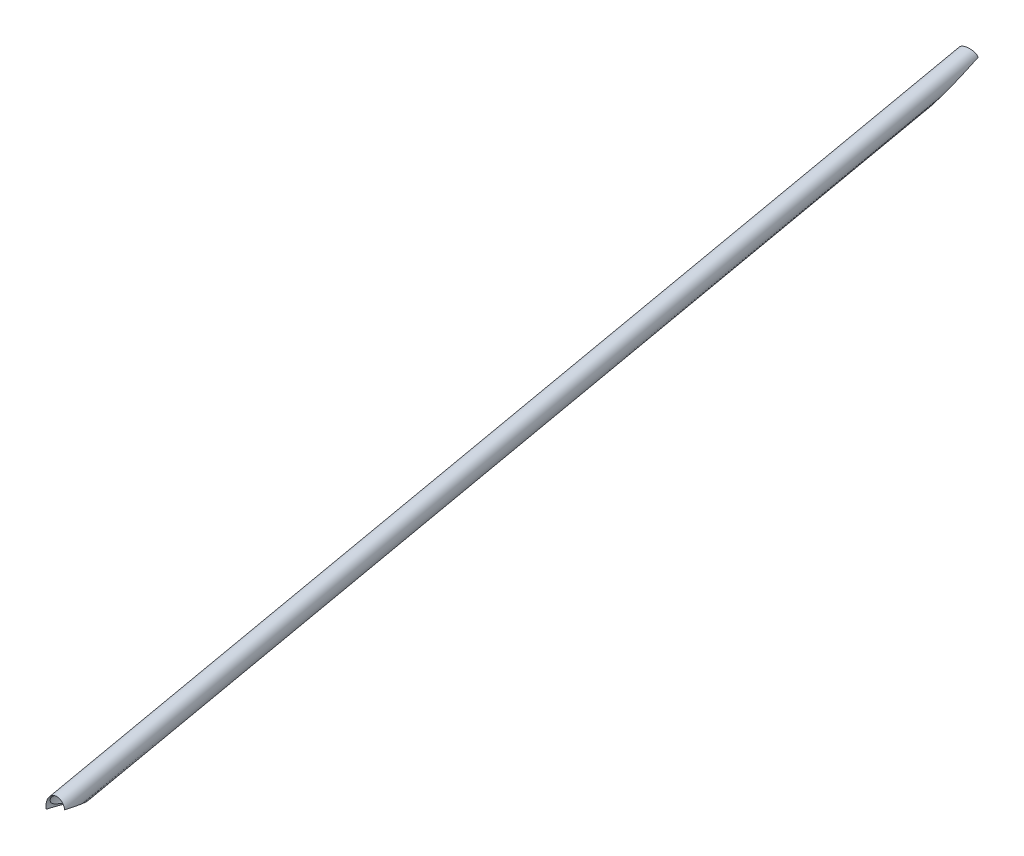
ISO-10303-21;
HEADER;
FILE_DESCRIPTION(('STEP AP214'),'2;1');
FILE_NAME('part.step','',(''),(''),'','','');
FILE_SCHEMA(('AUTOMOTIVE_DESIGN { 1 0 10303 214 1 1 1 1 }'));
ENDSEC;
DATA;
#1=APPLICATION_CONTEXT('core data for automotive mechanical design processes');
#2=APPLICATION_PROTOCOL_DEFINITION('international standard','automotive_design',2000,#1);
#3=PRODUCT_CONTEXT('',#1,'mechanical');
#4=PRODUCT('Part','Part','',(#3));
#5=PRODUCT_RELATED_PRODUCT_CATEGORY('part','',(#4));
#6=PRODUCT_DEFINITION_FORMATION('','',#4);
#7=PRODUCT_DEFINITION_CONTEXT('part definition',#1,'design');
#8=PRODUCT_DEFINITION('design','',#6,#7);
#9=PRODUCT_DEFINITION_SHAPE('','',#8);
#10=(LENGTH_UNIT() NAMED_UNIT(*) SI_UNIT(.MILLI.,.METRE.));
#11=(NAMED_UNIT(*) PLANE_ANGLE_UNIT() SI_UNIT($,.RADIAN.));
#12=(NAMED_UNIT(*) SI_UNIT($,.STERADIAN.) SOLID_ANGLE_UNIT());
#13=UNCERTAINTY_MEASURE_WITH_UNIT(LENGTH_MEASURE(1.E-05),#10,'distance_accuracy_value','');
#14=(GEOMETRIC_REPRESENTATION_CONTEXT(3) GLOBAL_UNCERTAINTY_ASSIGNED_CONTEXT((#13)) GLOBAL_UNIT_ASSIGNED_CONTEXT((#10,
#11,#12)) REPRESENTATION_CONTEXT('',''));
#15=CARTESIAN_POINT('',(0.,0.,0.));
#16=DIRECTION('',(0.,0.,1.));
#17=DIRECTION('',(1.,0.,0.));
#18=AXIS2_PLACEMENT_3D('',#15,#16,#17);
#19=CARTESIAN_POINT('',(-325.,320.,-1580.));
#20=DIRECTION('',(0.0427126536783039,-0.062929792122569,-0.997103540500769));
#21=DIRECTION('',(0.,0.998014330188054,-0.0629872744234135));
#22=AXIS2_PLACEMENT_3D('',#19,#20,#21);
#23=PLANE('',#22);
#24=CARTESIAN_POINT('',(-325.,320.,-1580.));
#25=DIRECTION('',(0.0427126536783039,-0.062929792122569,-0.997103540500769));
#26=DIRECTION('',(-0.611440895819702,0.787641342485715,-0.0759022168747456));
#27=AXIS2_PLACEMENT_3D('',#24,#25,#26);
#28=ELLIPSE('',#27,11.2549576190536,11.);
#29=CARTESIAN_POINT('',(-315.659557692795,325.814860529695,-1579.96687694731));
#30=VERTEX_POINT('',#29);
#31=CARTESIAN_POINT('',(-314.891903689022,324.374891386604,-1579.84311297152));
#32=VERTEX_POINT('',#31);
#33=EDGE_CURVE('E116',#30,#32,#28,.T.);
#34=ORIENTED_EDGE('',*,*,#33,.T.);
#35=CARTESIAN_POINT('',(-325.,320.,-1580.));
#36=DIRECTION('',(0.0427126536783039,-0.062929792122569,-0.997103540500769));
#37=DIRECTION('',(0.489400664257567,-0.868759037548238,0.07579396085779));
#38=AXIS2_PLACEMENT_3D('',#35,#36,#37);
#39=ELLIPSE('',#38,12.7182524712078,11.);
#40=EDGE_CURVE('E121',#32,#30,#39,.F.);
#41=ORIENTED_EDGE('',*,*,#40,.T.);
#42=EDGE_LOOP('',(#34,#41));
#43=FACE_BOUND('',#42,.T.);
#44=ADVANCED_FACE('F41',(#43),#23,.T.);
#45=CARTESIAN_POINT('',(-225.,200.,-450.));
#46=DIRECTION('',(-0.0876619818920292,0.105194378270435,-0.99058039537993));
#47=DIRECTION('',(0.,0.994408591727349,0.105600912395825));
#48=AXIS2_PLACEMENT_3D('',#45,#46,#47);
#49=CYLINDRICAL_SURFACE('',#48,9.79999999999998);
#50=CARTESIAN_POINT('',(-324.508739489875,329.155691586778,-1573.4138672941));
#51=CARTESIAN_POINT('',(-324.268462217856,329.155384934462,-1573.41099257477));
#52=CARTESIAN_POINT('',(-324.028163922259,329.146052864396,-1573.4060575788));
#53=CARTESIAN_POINT('',(-323.549018961354,329.109410245513,-1573.3908155344));
#54=CARTESIAN_POINT('',(-323.310173035085,329.082091209352,-1573.38050595041));
#55=CARTESIAN_POINT('',(-322.835036875438,329.009654067817,-1573.3529590625));
#56=CARTESIAN_POINT('',(-322.598753444107,328.964496821543,-1573.33570652266));
#57=CARTESIAN_POINT('',(-322.130980790888,328.856901620574,-1573.29246922714));
#58=CARTESIAN_POINT('',(-321.899491009931,328.794465693382,-1573.2664854959));
#59=CARTESIAN_POINT('',(-321.44174229571,328.652740938666,-1573.20354928381));
#60=CARTESIAN_POINT('',(-321.215521202537,328.573357048359,-1573.16653444433));
#61=CARTESIAN_POINT('',(-320.771641627187,328.399248591146,-1573.07934124367));
#62=CARTESIAN_POINT('',(-320.553983323649,328.304523704401,-1573.02916260803));
#63=CARTESIAN_POINT('',(-320.129734859475,328.101819282316,-1572.91356185013));
#64=CARTESIAN_POINT('',(-319.923121105446,327.993869767537,-1572.84817396092));
#65=CARTESIAN_POINT('',(-319.522427569048,327.767020417816,-1572.70025295484));
#66=CARTESIAN_POINT('',(-319.328345709577,327.648122405502,-1572.61772268885));
#67=CARTESIAN_POINT('',(-318.972576930882,327.414338245769,-1572.4433427167));
#68=CARTESIAN_POINT('',(-318.809575585291,327.300187997735,-1572.35318194191));
#69=CARTESIAN_POINT('',(-318.495933350835,327.067788895399,-1572.15788781455));
#70=CARTESIAN_POINT('',(-318.345292655277,326.949539977039,-1572.05275422789));
#71=CARTESIAN_POINT('',(-318.056679613174,326.711262587282,-1571.828119347));
#72=CARTESIAN_POINT('',(-317.918708068977,326.591234003735,-1571.70861714389));
#73=CARTESIAN_POINT('',(-317.655181467535,326.351395739851,-1571.45645322827));
#74=CARTESIAN_POINT('',(-317.529628427703,326.231586098175,-1571.3237893846));
#75=CARTESIAN_POINT('',(-317.243890205332,325.947695339248,-1570.99323696469));
#76=CARTESIAN_POINT('',(-317.089108112663,325.784426307156,-1570.78997641171));
#77=CARTESIAN_POINT('',(-316.799242184499,325.463814239222,-1570.36556608364));
#78=CARTESIAN_POINT('',(-316.66416897332,325.306474433248,-1570.14440675913));
#79=CARTESIAN_POINT('',(-316.4100643807,324.998108519678,-1569.68737158513));
#80=CARTESIAN_POINT('',(-316.29110076506,324.847110820651,-1569.45143932354));
#81=CARTESIAN_POINT('',(-316.122982836111,324.625929440791,-1569.08966179315));
#82=CARTESIAN_POINT('',(-316.068668611629,324.553093652753,-1568.9677659141));
#83=CARTESIAN_POINT('',(-315.96314215767,324.409120794857,-1568.72164743045));
#84=CARTESIAN_POINT('',(-315.911929916655,324.337983718683,-1568.5974248345));
#85=CARTESIAN_POINT('',(-315.778899234167,324.150192584166,-1568.26297596945));
#86=CARTESIAN_POINT('',(-315.699583276547,324.035001080538,-1568.05093195501));
#87=CARTESIAN_POINT('',(-315.547525233777,323.808788671949,-1567.62229190242));
#88=CARTESIAN_POINT('',(-315.474784220197,323.697768448531,-1567.40569512933));
#89=CARTESIAN_POINT('',(-315.334842245937,323.479434879813,-1566.96871709641));
#90=CARTESIAN_POINT('',(-315.267644486624,323.372123697073,-1566.74833373727));
#91=CARTESIAN_POINT('',(-315.138015471025,323.16086581113,-1566.30456582026));
#92=CARTESIAN_POINT('',(-315.075584547522,323.056919343115,-1566.08118105414));
#93=CARTESIAN_POINT('',(-314.89411189487,322.749053807716,-1565.40626682987));
#94=CARTESIAN_POINT('',(-314.781219078692,322.549628628731,-1564.95103119567));
#95=CARTESIAN_POINT('',(-314.5678216649,322.1601954055,-1564.03393158466));
#96=CARTESIAN_POINT('',(-314.467313458796,321.970184627883,-1563.57206958256));
#97=CARTESIAN_POINT('',(-314.275401430575,321.596332224166,-1562.64065031704));
#98=CARTESIAN_POINT('',(-314.184056063738,321.412534626059,-1562.1710634653));
#99=CARTESIAN_POINT('',(-314.009277908373,321.05069315521,-1561.2282011042));
#100=CARTESIAN_POINT('',(-313.925845594235,320.872649627849,-1560.75492537554));
#101=CARTESIAN_POINT('',(-313.765712062502,320.521350684482,-1559.80633404262));
#102=CARTESIAN_POINT('',(-313.689000580378,320.348088253861,-1559.33102275444));
#103=CARTESIAN_POINT('',(-313.541232239728,320.005090206029,-1558.37824818393));
#104=CARTESIAN_POINT('',(-313.470175500241,319.835354663121,-1557.90078485653));
#105=CARTESIAN_POINT('',(-313.334054021778,319.501116690112,-1556.95119260565));
#106=CARTESIAN_POINT('',(-313.268916660941,319.336574018119,-1556.47908820582));
#107=CARTESIAN_POINT('',(-313.1430222647,319.009586204916,-1555.53356903269));
#108=CARTESIAN_POINT('',(-313.082265270288,318.847141083345,-1555.06015424717));
#109=CARTESIAN_POINT('',(-312.906029471048,318.36220055103,-1553.63830717083));
#110=CARTESIAN_POINT('',(-312.796590132545,318.042110541322,-1552.68830241029));
#111=CARTESIAN_POINT('',(-312.592097944712,317.405213502389,-1550.78493171594));
#112=CARTESIAN_POINT('',(-312.497055041223,317.088408882377,-1549.83156391986));
#113=CARTESIAN_POINT('',(-312.320806828936,316.456225520595,-1547.92310192935));
#114=CARTESIAN_POINT('',(-312.239601215361,316.140846747568,-1546.9680077734));
#115=CARTESIAN_POINT('',(-312.091499447856,315.51180422466,-1545.06267745196));
#116=CARTESIAN_POINT('',(-312.024518560362,315.198141823646,-1544.1124474315));
#117=CARTESIAN_POINT('',(-311.90482053405,314.569233317766,-1542.21159173712));
#118=CARTESIAN_POINT('',(-311.852103620119,314.25398718801,-1541.26096605719));
#119=CARTESIAN_POINT('',(-311.76209485636,313.620797672135,-1539.36036212128));
#120=CARTESIAN_POINT('',(-311.724795879752,313.3028556017,-1538.41038376927));
#121=CARTESIAN_POINT('',(-311.667404886,312.66284594251,-1536.51132323718));
#122=CARTESIAN_POINT('',(-311.647312276486,312.340778496168,-1535.56224102738));
#123=CARTESIAN_POINT('',(-311.627043388048,311.691191666295,-1533.6661841849));
#124=CARTESIAN_POINT('',(-311.626857766649,311.36367491234,-1532.71920877216));
#125=CARTESIAN_POINT('',(-311.644659130688,310.866730987072,-1531.30069083397));
#126=CARTESIAN_POINT('',(-311.653610947495,310.700093687073,-1530.82805179804));
#127=CARTESIAN_POINT('',(-311.67830307188,310.364653069603,-1529.88371814603));
#128=CARTESIAN_POINT('',(-311.694043328969,310.195849768252,-1529.41202352295));
#129=CARTESIAN_POINT('',(-311.733383794846,309.854472053615,-1528.46638763432));
#130=CARTESIAN_POINT('',(-311.757041048534,309.681879020815,-1527.99245541475));
#131=CARTESIAN_POINT('',(-311.813436730258,309.333690201409,-1527.04624033991));
#132=CARTESIAN_POINT('',(-311.846174934786,309.158094488808,-1526.57395744433));
#133=CARTESIAN_POINT('',(-311.922369881243,308.803520222796,-1525.63213223618));
#134=CARTESIAN_POINT('',(-311.96581429053,308.624545778909,-1525.16258740221));
#135=CARTESIAN_POINT('',(-312.065786203341,308.262272073939,-1524.22661188544));
#136=CARTESIAN_POINT('',(-312.122312195228,308.078973314746,-1523.76018084922));
#137=CARTESIAN_POINT('',(-312.252437834875,307.705247882916,-1522.82741352473));
#138=CARTESIAN_POINT('',(-312.326189900717,307.514771118661,-1522.36111765442));
#139=CARTESIAN_POINT('',(-312.453720291011,307.223463723417,-1521.66635861196));
#140=CARTESIAN_POINT('',(-312.499120904391,307.125291629591,-1521.4352413765));
#141=CARTESIAN_POINT('',(-312.596617841785,306.926875325517,-1520.97533693104));
#142=CARTESIAN_POINT('',(-312.648713343141,306.826631371123,-1520.74654943849));
#143=CARTESIAN_POINT('',(-312.76060529518,306.624388734751,-1520.29355533346));
#144=CARTESIAN_POINT('',(-312.820347897791,306.522406277369,-1520.06932831505));
#145=CARTESIAN_POINT('',(-312.949679329555,306.315611434241,-1519.62506889827));
#146=CARTESIAN_POINT('',(-313.019265980909,306.210799678559,-1519.40503558431));
#147=CARTESIAN_POINT('',(-313.170706257539,305.998196185259,-1518.97187028511));
#148=CARTESIAN_POINT('',(-313.252508806963,305.890418311339,-1518.75871385765));
#149=CARTESIAN_POINT('',(-313.432518335168,305.670871044554,-1518.34168832311));
#150=CARTESIAN_POINT('',(-313.530702499793,305.559107370463,-1518.13780679486));
#151=CARTESIAN_POINT('',(-313.69607856018,305.386890506061,-1517.84180906562));
#152=CARTESIAN_POINT('',(-313.754816099455,305.328189059809,-1517.74396970626));
#153=CARTESIAN_POINT('',(-313.879523084356,305.209433030582,-1517.55362961636));
#154=CARTESIAN_POINT('',(-313.945499455091,305.149377196317,-1517.4611341295));
#155=CARTESIAN_POINT('',(-314.08543017257,305.028619363818,-1517.28455157514));
#156=CARTESIAN_POINT('',(-314.159303502986,304.967928783378,-1517.20039350135));
#157=CARTESIAN_POINT('',(-314.317044664936,304.845799750756,-1517.04280801468));
#158=CARTESIAN_POINT('',(-314.40089083017,304.784363171073,-1516.9693580842));
#159=CARTESIAN_POINT('',(-314.563698890422,304.67282163741,-1516.84972524615));
#160=CARTESIAN_POINT('',(-314.640756831397,304.622696062413,-1516.80101240086));
#161=CARTESIAN_POINT('',(-314.802722896911,304.523563000484,-1516.71708832579));
#162=CARTESIAN_POINT('',(-314.887629307008,304.47455527227,-1516.68187415594));
#163=CARTESIAN_POINT('',(-315.065077427135,304.378811345447,-1516.62809566722));
#164=CARTESIAN_POINT('',(-315.157685839986,304.332102131473,-1516.60969798977));
#165=CARTESIAN_POINT('',(-315.346905626979,304.243477520672,-1516.59232483161));
#166=CARTESIAN_POINT('',(-315.443514327192,304.201558989869,-1516.59333657961));
#167=CARTESIAN_POINT('',(-315.626560441187,304.128121957754,-1516.61301863811));
#168=CARTESIAN_POINT('',(-315.712965781718,304.095968728491,-1516.6297638109));
#169=CARTESIAN_POINT('',(-315.884005177224,304.036806489417,-1516.67621740403));
#170=CARTESIAN_POINT('',(-315.968637778797,304.009801564044,-1516.70593605598));
#171=CARTESIAN_POINT('',(-316.185368256323,303.945736211366,-1516.79713665646));
#172=CARTESIAN_POINT('',(-316.315065373529,303.912534111049,-1516.86694681826));
#173=CARTESIAN_POINT('',(-316.565282102444,303.856270163453,-1517.02471591539));
#174=CARTESIAN_POINT('',(-316.685770827721,303.833241301817,-1517.11273254849));
#175=CARTESIAN_POINT('',(-316.917723217268,303.795072222553,-1517.30042125114));
#176=CARTESIAN_POINT('',(-317.029217594546,303.779904108381,-1517.40005054516));
#177=CARTESIAN_POINT('',(-317.244987731152,303.755535614636,-1517.60760216894));
#178=CARTESIAN_POINT('',(-317.349255600484,303.746341668818,-1517.71553329982));
#179=CARTESIAN_POINT('',(-317.551874137249,303.732627771104,-1517.93753319046));
#180=CARTESIAN_POINT('',(-317.650209289523,303.728119613312,-1518.05161668097));
#181=CARTESIAN_POINT('',(-317.841584475889,303.722887546103,-1518.28408468139));
#182=CARTESIAN_POINT('',(-317.934627216381,303.722161684993,-1518.40246694133));
#183=CARTESIAN_POINT('',(-318.194269654661,303.724476652333,-1518.7456012645));
#184=CARTESIAN_POINT('',(-318.355446235069,303.73128599644,-1518.974424597));
#185=CARTESIAN_POINT('',(-318.666218808637,303.752555367771,-1519.43952090882));
#186=CARTESIAN_POINT('',(-318.815807028671,303.76702048018,-1519.67579874143));
#187=CARTESIAN_POINT('',(-319.106045303391,303.801844104615,-1520.15400240679));
#188=CARTESIAN_POINT('',(-319.246676019106,303.822214873582,-1520.3959390141));
#189=CARTESIAN_POINT('',(-319.520399720282,303.867620066768,-1520.88361558397));
#190=CARTESIAN_POINT('',(-319.653491812882,303.892655041906,-1521.12935599266));
#191=CARTESIAN_POINT('',(-319.914008631707,303.946669865335,-1521.6249144722));
#192=CARTESIAN_POINT('',(-320.041402779519,303.975668236639,-1521.87474652978));
#193=CARTESIAN_POINT('',(-320.290796946808,304.036892386498,-1522.37670443827));
#194=CARTESIAN_POINT('',(-320.412796663534,304.069118345865,-1522.62883041697));
#195=CARTESIAN_POINT('',(-320.651961099819,304.136278985237,-1523.13455168497));
#196=CARTESIAN_POINT('',(-320.769132519923,304.171209703405,-1523.38814434));
#197=CARTESIAN_POINT('',(-320.999396948486,304.243462461804,-1523.89682278359));
#198=CARTESIAN_POINT('',(-321.112490054811,304.280784444596,-1524.15190853615));
#199=CARTESIAN_POINT('',(-321.443986861764,304.395077203072,-1524.91353899504));
#200=CARTESIAN_POINT('',(-321.657156774873,304.475110559271,-1525.42190595589));
#201=CARTESIAN_POINT('',(-322.072151540842,304.641805445488,-1526.44219036377));
#202=CARTESIAN_POINT('',(-322.273975306176,304.728467609004,-1526.95410814589));
#203=CARTESIAN_POINT('',(-322.668206131507,304.907378807367,-1527.98076784604));
#204=CARTESIAN_POINT('',(-322.86061018138,304.999629607294,-1528.49551060912));
#205=CARTESIAN_POINT('',(-323.237339140959,305.188930854004,-1529.52706811478));
#206=CARTESIAN_POINT('',(-323.421663882965,305.285981400324,-1530.04388290013));
#207=CARTESIAN_POINT('',(-323.783607451138,305.484492488036,-1531.08001890965));
#208=CARTESIAN_POINT('',(-323.961214415395,305.585960206506,-1531.59934289388));
#209=CARTESIAN_POINT('',(-324.310232431688,305.792743132048,-1532.63930345545));
#210=CARTESIAN_POINT('',(-324.481643437547,305.898058367785,-1533.15994004254));
#211=CARTESIAN_POINT('',(-324.987568058076,306.219253005989,-1534.72322712489));
#212=CARTESIAN_POINT('',(-325.313845348294,306.440421467298,-1535.76746317491));
#213=CARTESIAN_POINT('',(-325.947865629235,306.894832452987,-1537.85647235823));
#214=CARTESIAN_POINT('',(-326.255644923264,307.128049538093,-1538.90124009161));
#215=CARTESIAN_POINT('',(-326.856271078424,307.606358981848,-1540.99239596754));
#216=CARTESIAN_POINT('',(-327.14911723304,307.851451901299,-1542.03878418433));
#217=CARTESIAN_POINT('',(-327.721824607873,308.353376478358,-1544.1312790954));
#218=CARTESIAN_POINT('',(-328.001696693615,308.610197942102,-1545.17738526814));
#219=CARTESIAN_POINT('',(-328.550494495169,309.136605022868,-1547.26922475248));
#220=CARTESIAN_POINT('',(-328.819420532671,309.406190264276,-1548.31495807414));
#221=CARTESIAN_POINT('',(-329.322811839342,309.933701426403,-1550.3058613186));
#222=CARTESIAN_POINT('',(-329.558126977379,310.190309488514,-1551.25116564137));
#223=CARTESIAN_POINT('',(-330.022128191402,310.717850221648,-1553.13962404692));
#224=CARTESIAN_POINT('',(-330.250813043114,310.988785512419,-1554.08277770331));
#225=CARTESIAN_POINT('',(-330.589511235814,311.408772143102,-1555.4942753125));
#226=CARTESIAN_POINT('',(-330.701666302686,311.55100072447,-1555.96413857069));
#227=CARTESIAN_POINT('',(-330.924662391806,311.840737058636,-1556.90254492151));
#228=CARTESIAN_POINT('',(-331.03550343047,311.988244745389,-1557.37108803058));
#229=CARTESIAN_POINT('',(-331.255956817724,312.289431616732,-1558.30640007514));
#230=CARTESIAN_POINT('',(-331.365569348727,312.443109869141,-1558.77316926704));
#231=CARTESIAN_POINT('',(-331.583655205451,312.757872615585,-1559.70446403109));
#232=CARTESIAN_POINT('',(-331.692128560616,312.918956917623,-1560.16898966106));
#233=CARTESIAN_POINT('',(-331.915359987302,313.261494219682,-1561.12680398728));
#234=CARTESIAN_POINT('',(-332.030039668569,313.443586645677,-1561.61988365235));
#235=CARTESIAN_POINT('',(-332.258056688282,313.820811810879,-1562.60145086819));
#236=CARTESIAN_POINT('',(-332.371393832088,314.015946414342,-1563.08993775103));
#237=CARTESIAN_POINT('',(-332.596451098388,314.423186931333,-1564.06068841944));
#238=CARTESIAN_POINT('',(-332.708170017679,314.635304777198,-1564.5429475482));
#239=CARTESIAN_POINT('',(-332.873730499241,314.970211484922,-1565.25891785446));
#240=CARTESIAN_POINT('',(-332.928575842523,315.084623592522,-1565.49631579399));
#241=CARTESIAN_POINT('',(-333.037366086136,315.319952523769,-1565.96806627113));
#242=CARTESIAN_POINT('',(-333.091311040889,315.440868952401,-1566.2024189926));
#243=CARTESIAN_POINT('',(-333.211163889499,315.721071352655,-1566.72480953111));
#244=CARTESIAN_POINT('',(-333.276734982408,315.882456855734,-1567.01180774677));
#245=CARTESIAN_POINT('',(-333.404992926487,316.219412918592,-1567.57798278386));
#246=CARTESIAN_POINT('',(-333.467680524206,316.394979773943,-1567.85716162235));
#247=CARTESIAN_POINT('',(-333.588506472434,316.762946933065,-1568.40465494302));
#248=CARTESIAN_POINT('',(-333.646651895587,316.955320036507,-1568.67298598874));
#249=CARTESIAN_POINT('',(-333.756010489853,317.3602352138,-1569.19549570415));
#250=CARTESIAN_POINT('',(-333.807227194151,317.572766913331,-1569.44968154773));
#251=CARTESIAN_POINT('',(-333.884171721041,317.948487037498,-1569.860165679));
#252=CARTESIAN_POINT('',(-333.912792244731,318.105477000578,-1570.02159048381));
#253=CARTESIAN_POINT('',(-333.963566132739,318.430465239119,-1570.33400142513));
#254=CARTESIAN_POINT('',(-333.985721887595,318.598459417242,-1570.48499140442));
#255=CARTESIAN_POINT('',(-334.021744053221,318.945227537559,-1570.77459253945));
#256=CARTESIAN_POINT('',(-334.035623803679,319.123983618237,-1570.91322330791));
#257=CARTESIAN_POINT('',(-334.053192462749,319.491813481666,-1571.17681854285));
#258=CARTESIAN_POINT('',(-334.056881825603,319.680886804138,-1571.30178361825));
#259=CARTESIAN_POINT('',(-334.052138912278,320.06947338724,-1571.5379549131));
#260=CARTESIAN_POINT('',(-334.043605977199,320.269060151263,-1571.64903859142));
#261=CARTESIAN_POINT('',(-334.012556302572,320.67498964346,-1571.85587306078));
#262=CARTESIAN_POINT('',(-333.990039085936,320.8813326019,-1571.95162332855));
#263=CARTESIAN_POINT('',(-333.929771519599,321.298346719427,-1572.12835752254));
#264=CARTESIAN_POINT('',(-333.892003657665,321.509022589124,-1572.20932431723));
#265=CARTESIAN_POINT('',(-333.800542974006,321.931721617294,-1572.35753194896));
#266=CARTESIAN_POINT('',(-333.74685012761,322.143744777855,-1572.42477276475));
#267=CARTESIAN_POINT('',(-333.629276710887,322.546235967368,-1572.54127194721));
#268=CARTESIAN_POINT('',(-333.566869450526,322.736818858066,-1572.59163705024));
#269=CARTESIAN_POINT('',(-333.429003410921,323.115281399367,-1572.68381146962));
#270=CARTESIAN_POINT('',(-333.35354583552,323.30316129758,-1572.72562157437));
#271=CARTESIAN_POINT('',(-333.18986649637,323.674786210649,-1572.80201996259));
#272=CARTESIAN_POINT('',(-333.101643749711,323.858530905837,-1572.83660768945));
#273=CARTESIAN_POINT('',(-332.912858310884,324.220634016993,-1572.89980083997));
#274=CARTESIAN_POINT('',(-332.812294533623,324.398991957606,-1572.92840573699));
#275=CARTESIAN_POINT('',(-332.584485163934,324.773662296555,-1572.98439417987));
#276=CARTESIAN_POINT('',(-332.455474312445,324.969011760708,-1573.01105164639));
#277=CARTESIAN_POINT('',(-332.182935394757,325.349946625541,-1573.05945640332));
#278=CARTESIAN_POINT('',(-332.039406348059,325.535531365462,-1573.08120336176));
#279=CARTESIAN_POINT('',(-331.738707348242,325.895803179059,-1573.12095429782));
#280=CARTESIAN_POINT('',(-331.581533908916,326.070487447899,-1573.13895731481));
#281=CARTESIAN_POINT('',(-331.254538351328,326.407879510486,-1573.17214559107));
#282=CARTESIAN_POINT('',(-331.084715477769,326.570586587919,-1573.18733068187));
#283=CARTESIAN_POINT('',(-330.714428940016,326.900003881781,-1573.21713535041));
#284=CARTESIAN_POINT('',(-330.51263739317,327.065246004316,-1573.23151641065));
#285=CARTESIAN_POINT('',(-330.096169130773,327.37879344857,-1573.25841957194));
#286=CARTESIAN_POINT('',(-329.881491393652,327.527097424782,-1573.27094152535));
#287=CARTESIAN_POINT('',(-329.440544873409,327.805904136236,-1573.29458670889));
#288=CARTESIAN_POINT('',(-329.214266520493,327.936391838235,-1573.30570875719));
#289=CARTESIAN_POINT('',(-328.751819196653,328.178557889196,-1573.32675507398));
#290=CARTESIAN_POINT('',(-328.515650563179,328.290236879249,-1573.33667938329));
#291=CARTESIAN_POINT('',(-328.026822330638,328.497513746336,-1573.35563354995));
#292=CARTESIAN_POINT('',(-327.773875088411,328.592437793563,-1573.3646216579));
#293=CARTESIAN_POINT('',(-327.260853516326,328.760711910301,-1573.38103455383));
#294=CARTESIAN_POINT('',(-327.000779225195,328.834062097008,-1573.38845935031));
#295=CARTESIAN_POINT('',(-326.475934647514,328.958505124931,-1573.40119395844));
#296=CARTESIAN_POINT('',(-326.211176208482,329.009647542611,-1573.40650847877));
#297=CARTESIAN_POINT('',(-325.678372617681,329.089494506777,-1573.41422914122));
#298=CARTESIAN_POINT('',(-325.41032958797,329.11821283688,-1573.41663707046));
#299=CARTESIAN_POINT('',(-325.036290306998,329.142441945273,-1573.4171773283));
#300=CARTESIAN_POINT('',(-324.930848284082,329.147526857415,-1573.41701903822));
#301=CARTESIAN_POINT('',(-324.719852026231,329.154219109096,-1573.4159954947));
#302=CARTESIAN_POINT('',(-324.614297786838,329.155826304872,-1573.41513021204));
#303=CARTESIAN_POINT('',(-324.508739489875,329.155691586778,-1573.4138672941));
#304=B_SPLINE_CURVE_WITH_KNOTS('',3,(#50,#51,#52,#53,#54,#55,#56,#57,#58,#59,#60,#61,#62,#63,
#64,#65,#66,#67,#68,#69,#70,#71,#72,#73,#74,#75,#76,#77,#78,#79,#80,#81,#82,#83,#84,#85,#86,#87,
#88,#89,#90,#91,#92,#93,#94,#95,#96,#97,#98,#99,#100,#101,#102,#103,#104,#105,#106,#107,#108,
#109,#110,#111,#112,#113,#114,#115,#116,#117,#118,#119,#120,#121,#122,#123,#124,#125,#126,#127,
#128,#129,#130,#131,#132,#133,#134,#135,#136,#137,#138,#139,#140,#141,#142,#143,#144,#145,#146,
#147,#148,#149,#150,#151,#152,#153,#154,#155,#156,#157,#158,#159,#160,#161,#162,#163,#164,#165,
#166,#167,#168,#169,#170,#171,#172,#173,#174,#175,#176,#177,#178,#179,#180,#181,#182,#183,#184,
#185,#186,#187,#188,#189,#190,#191,#192,#193,#194,#195,#196,#197,#198,#199,#200,#201,#202,#203,
#204,#205,#206,#207,#208,#209,#210,#211,#212,#213,#214,#215,#216,#217,#218,#219,#220,#221,#222,
#223,#224,#225,#226,#227,#228,#229,#230,#231,#232,#233,#234,#235,#236,#237,#238,#239,#240,#241,
#242,#243,#244,#245,#246,#247,#248,#249,#250,#251,#252,#253,#254,#255,#256,#257,#258,#259,#260,
#261,#262,#263,#264,#265,#266,#267,#268,#269,#270,#271,#272,#273,#274,#275,#276,#277,#278,#279,
#280,#281,#282,#283,#284,#285,#286,#287,#288,#289,#290,#291,#292,#293,#294,#295,#296,#297,#298,
#299,#300,#301,#302,#303),.UNSPECIFIED.,.T.,.F.,(4,2,2,2,2,2,2,2,2,2,2,2,2,2,2,2,2,2,2,2,2,2,2,
2,2,2,2,2,2,2,2,2,2,2,2,2,2,2,2,2,2,2,2,2,2,2,2,2,2,2,2,2,2,2,2,2,2,2,2,2,2,2,2,2,2,2,2,2,2,2,2,
2,2,2,2,2,2,2,2,2,2,2,2,2,2,2,2,2,2,2,2,2,2,2,2,2,2,2,2,2,2,2,2,2,2,2,2,2,2,2,2,2,2,2,2,2,2,2,2,
2,2,2,2,2,2,2,4),(0.,0.720799098111247,1.44193855704914,2.16466922089066,2.88731511451336,
3.61412620543011,4.34095245125645,5.06615831884392,5.79124367679238,6.44575503682462,
7.10027663079302,7.75483964760211,8.40950882544345,9.31755356214505,10.2260859972985,
11.138328776811,11.5943789870863,12.0504275011268,12.8122618298481,13.5742200977074,
14.3366153785937,15.0990638352489,16.6276177515494,18.1557252363007,19.693032584593,
21.230432036851,22.7654409719947,24.3004822123385,25.8129999752639,27.3255318903921,
30.350692689847,33.377933995387,36.4051086148223,39.4137111850813,42.4223611862941,
45.4296189110935,48.4367730996686,51.4425160057374,52.9461777766895,54.4498283644198,
55.964555341448,57.4792450401574,58.9921980340451,60.5049762865401,62.0316838750842,
62.7971263183791,63.5624747950396,64.3227033519033,65.0827639854926,65.8397313753257,
66.5956532280853,66.9804033103963,67.3655247314467,67.7470179207558,68.1276969436699,
68.4388616219228,68.7499584884003,69.0641057347824,69.3780462810651,69.6579721623582,
69.9381192086672,70.3884643006441,70.8402590591093,71.2904392968674,71.7411035468996,
72.1928993899029,72.6444620800249,73.4836766459796,74.3234493435841,75.1649775865233,
76.006605290921,76.8523101755427,77.6980624637438,78.542598542283,79.3871143416808,
81.0579730103192,82.7289915583443,84.4005406503425,86.0721244216756,87.7465337311574,
89.4209555170783,92.7691273410848,96.1104978561965,99.4520263119184,102.79070378723,
106.129283072284,109.151332138024,112.173935712253,113.684610887391,115.19526716965,
116.705696091429,118.216085878079,119.829921376166,121.443988052083,123.059198885463,
123.866649306209,124.674050744802,125.680908877665,126.687504846098,127.692500830691,
128.696982386688,129.377438029421,130.057641734043,130.736746066663,131.415820127386,
132.100519083611,132.785241400229,133.470752225783,134.156264113297,134.775951636486,
135.395582026256,136.015260152529,136.634992803482,137.341113647794,138.047282212482,
138.753631740664,139.460023478812,140.242764873188,141.025568402629,141.809028427013,
142.59246174194,143.402464622997,144.212463103717,145.020643935305,145.828327603154,
146.144975031069,146.461635548353),.UNSPECIFIED.);
#305=CARTESIAN_POINT('',(-324.508739489875,329.155691586778,-1573.4138672941));
#306=VERTEX_POINT('',#305);
#307=EDGE_CURVE('E109',#306,#306,#304,.T.);
#308=ORIENTED_EDGE('',*,*,#307,.T.);
#309=EDGE_LOOP('',(#308));
#310=FACE_BOUND('',#309,.T.);
#311=CARTESIAN_POINT('',(-225.452585120845,210.288306343942,-454.079322924064));
#312=CARTESIAN_POINT('',(-225.725490799836,210.287253688898,-454.069421938344));
#313=CARTESIAN_POINT('',(-225.99840840061,210.274807656964,-454.060095957921));
#314=CARTESIAN_POINT('',(-226.542361369307,210.227094706696,-454.041879019836));
#315=CARTESIAN_POINT('',(-226.81339585642,210.191817751833,-454.032988255347));
#316=CARTESIAN_POINT('',(-227.352003262097,210.098515411787,-454.015133533551));
#317=CARTESIAN_POINT('',(-227.619569477782,210.040451276019,-454.006169477169));
#318=CARTESIAN_POINT('',(-228.148825654578,209.901923949884,-453.987866174324));
#319=CARTESIAN_POINT('',(-228.410515636783,209.821460839938,-453.978526929207));
#320=CARTESIAN_POINT('',(-228.926013084578,209.638712094157,-453.959325027898));
#321=CARTESIAN_POINT('',(-229.179823970791,209.536436084334,-453.949462604022));
#322=CARTESIAN_POINT('',(-229.677860112655,209.310758687423,-453.929211262946));
#323=CARTESIAN_POINT('',(-229.92208509908,209.18735670752,-453.918822330978));
#324=CARTESIAN_POINT('',(-230.399078140652,208.920396086984,-453.897673749304));
#325=CARTESIAN_POINT('',(-230.631851903038,208.776847627579,-453.886914288908));
#326=CARTESIAN_POINT('',(-231.084440257298,208.470610733691,-453.865321063755));
#327=CARTESIAN_POINT('',(-231.304254967317,208.307922473745,-453.854487299677));
#328=CARTESIAN_POINT('',(-231.728696098249,207.965201841698,-453.833243844821));
#329=CARTESIAN_POINT('',(-231.933371801373,207.785230567025,-453.822832832749));
#330=CARTESIAN_POINT('',(-232.327010454907,207.408804207321,-453.803029925203));
#331=CARTESIAN_POINT('',(-232.515973316178,207.212349028791,-453.79363803551));
#332=CARTESIAN_POINT('',(-232.877075081587,206.804285219359,-453.776708295478));
#333=CARTESIAN_POINT('',(-233.049205114171,206.592668698554,-453.769171419663));
#334=CARTESIAN_POINT('',(-233.375469099241,206.155915109626,-453.757048764983));
#335=CARTESIAN_POINT('',(-233.529603241902,205.930778184421,-453.752462954929));
#336=CARTESIAN_POINT('',(-233.820768956019,205.465741943249,-453.747616630955));
#337=CARTESIAN_POINT('',(-233.957563905056,205.225693817931,-453.747410636276));
#338=CARTESIAN_POINT('',(-234.210997290531,204.735205900884,-453.753345419255));
#339=CARTESIAN_POINT('',(-234.327633088966,204.484764754446,-453.75948702682));
#340=CARTESIAN_POINT('',(-234.540034410503,203.975657154863,-453.78055619922));
#341=CARTESIAN_POINT('',(-234.635809098685,203.716994371266,-453.79547989504));
#342=CARTESIAN_POINT('',(-234.806049150407,203.193719194993,-453.837264293646));
#343=CARTESIAN_POINT('',(-234.880522716881,202.929109135034,-453.864120391134));
#344=CARTESIAN_POINT('',(-234.98874255156,202.477068351772,-453.923303167371));
#345=CARTESIAN_POINT('',(-235.027999059303,202.29040641616,-453.951543209249));
#346=CARTESIAN_POINT('',(-235.096033982378,201.916856990696,-454.017466904308));
#347=CARTESIAN_POINT('',(-235.124815391083,201.729969580617,-454.055147854442));
#348=CARTESIAN_POINT('',(-235.172015331545,201.357844151608,-454.141658333014));
#349=CARTESIAN_POINT('',(-235.190454623911,201.172603568285,-454.190465248185));
#350=CARTESIAN_POINT('',(-235.217407799036,200.805287645662,-454.301073897749));
#351=CARTESIAN_POINT('',(-235.225923508675,200.623211729844,-454.362873237832));
#352=CARTESIAN_POINT('',(-235.233084215187,200.291390800435,-454.490634627317));
#353=CARTESIAN_POINT('',(-235.233019401278,200.140896478127,-454.55457810325));
#354=CARTESIAN_POINT('',(-235.226758431914,199.845263836455,-454.693582464977));
#355=CARTESIAN_POINT('',(-235.220563096211,199.700124803691,-454.768641863244));
#356=CARTESIAN_POINT('',(-235.202787218584,199.416694865688,-454.929991169619));
#357=CARTESIAN_POINT('',(-235.191210203176,199.278399541455,-455.016273696792));
#358=CARTESIAN_POINT('',(-235.163533522632,199.009714548414,-455.199734314281));
#359=CARTESIAN_POINT('',(-235.147433693423,198.879325166616,-455.29691279979));
#360=CARTESIAN_POINT('',(-235.111687372353,198.627740042863,-455.500869873087));
#361=CARTESIAN_POINT('',(-235.09205594307,198.506508246092,-455.607606758316));
#362=CARTESIAN_POINT('',(-235.050039147555,198.272907700955,-455.829844996437));
#363=CARTESIAN_POINT('',(-235.027653688721,198.160539250823,-455.94534664399));
#364=CARTESIAN_POINT('',(-234.980829383239,197.944426763895,-456.183888331817));
#365=CARTESIAN_POINT('',(-234.956389008604,197.840689260963,-456.30693396288));
#366=CARTESIAN_POINT('',(-234.906036032429,197.641452131156,-456.559201972838));
#367=CARTESIAN_POINT('',(-234.88012340794,197.54595263276,-456.688424448018));
#368=CARTESIAN_POINT('',(-234.821062444288,197.341073270184,-456.982706689902));
#369=CARTESIAN_POINT('',(-234.787638752277,197.233667844363,-457.149082053121));
#370=CARTESIAN_POINT('',(-234.719699896987,197.028946821246,-457.487753094087));
#371=CARTESIAN_POINT('',(-234.685184288269,196.931635412841,-457.660051190519));
#372=CARTESIAN_POINT('',(-234.615319363241,196.745638289017,-458.009389251185));
#373=CARTESIAN_POINT('',(-234.57996887719,196.656965692514,-458.186435922271));
#374=CARTESIAN_POINT('',(-234.508635004465,196.487167369924,-458.543992620971));
#375=CARTESIAN_POINT('',(-234.47265153811,196.406042602174,-458.724503084878));
#376=CARTESIAN_POINT('',(-234.399779009933,196.249562378853,-459.089874687662));
#377=CARTESIAN_POINT('',(-234.362884631602,196.174267801099,-459.274760703523));
#378=CARTESIAN_POINT('',(-234.288522030127,196.029377833033,-459.646631967199));
#379=CARTESIAN_POINT('',(-234.251053796106,195.959782550891,-459.833617254781));
#380=CARTESIAN_POINT('',(-234.175552352303,195.825600282644,-460.209033887501));
#381=CARTESIAN_POINT('',(-234.137519757512,195.761008262489,-460.397463563874));
#382=CARTESIAN_POINT('',(-234.06080316225,195.636133348155,-460.775606405961));
#383=CARTESIAN_POINT('',(-234.022119164939,195.575850433084,-460.965319565447));
#384=CARTESIAN_POINT('',(-233.91682332568,195.418363346735,-461.478362601691));
#385=CARTESIAN_POINT('',(-233.849541012892,195.324715034465,-461.80264788357));
#386=CARTESIAN_POINT('',(-233.712595076017,195.14636234874,-462.453184301856));
#387=CARTESIAN_POINT('',(-233.642931194328,195.061658946888,-462.77943564776));
#388=CARTESIAN_POINT('',(-233.500863320646,194.899787890294,-463.433339059444));
#389=CARTESIAN_POINT('',(-233.428458302901,194.822623096007,-463.760991608056));
#390=CARTESIAN_POINT('',(-233.280593600798,194.674851043375,-464.417094052061));
#391=CARTESIAN_POINT('',(-233.205133791236,194.604244054198,-464.745543979616));
#392=CARTESIAN_POINT('',(-233.050600716324,194.468660994335,-465.403801336849));
#393=CARTESIAN_POINT('',(-232.971517596977,194.403701865364,-465.733609939362));
#394=CARTESIAN_POINT('',(-232.809593441994,194.27912246231,-466.393316376683));
#395=CARTESIAN_POINT('',(-232.726752312301,194.219502321963,-466.723214213518));
#396=CARTESIAN_POINT('',(-232.472109391478,194.048103112319,-467.712413704258));
#397=CARTESIAN_POINT('',(-232.294137914144,193.9437413965,-468.371437333725));
#398=CARTESIAN_POINT('',(-231.919662157258,193.753879281406,-469.682760757833));
#399=CARTESIAN_POINT('',(-231.723271405515,193.668272953869,-470.335077378895));
#400=CARTESIAN_POINT('',(-231.411162063833,193.553581772239,-471.309687261104));
#401=CARTESIAN_POINT('',(-231.304178307234,193.517631035917,-471.633987609968));
#402=CARTESIAN_POINT('',(-231.083759815583,193.45048464534,-472.28087748727));
#403=CARTESIAN_POINT('',(-230.970325380844,193.419288769971,-472.60346709459));
#404=CARTESIAN_POINT('',(-230.736700733727,193.362004136023,-473.245382629898));
#405=CARTESIAN_POINT('',(-230.616535229722,193.335898096249,-473.564715984934));
#406=CARTESIAN_POINT('',(-230.368259833718,193.289035232726,-474.200659750028));
#407=CARTESIAN_POINT('',(-230.24015056999,193.26827798661,-474.517270373177));
#408=CARTESIAN_POINT('',(-229.97504339787,193.232639639849,-475.146853958703));
#409=CARTESIAN_POINT('',(-229.838051291509,193.217754747675,-475.459829141201));
#410=CARTESIAN_POINT('',(-229.553864396265,193.194544932708,-476.081331062051));
#411=CARTESIAN_POINT('',(-229.406671537291,193.186218772716,-476.389858628591));
#412=CARTESIAN_POINT('',(-229.177257222452,193.179376728384,-476.847843201873));
#413=CARTESIAN_POINT('',(-229.099468211075,193.178035104676,-476.999485506569));
#414=CARTESIAN_POINT('',(-228.940712895033,193.177376654449,-477.301097800174));
#415=CARTESIAN_POINT('',(-228.85974662377,193.178059806649,-477.451067806643));
#416=CARTESIAN_POINT('',(-228.611591751011,193.183400830179,-477.898275144879));
#417=CARTESIAN_POINT('',(-228.439225208042,193.1913529561,-478.192652282525));
#418=CARTESIAN_POINT('',(-228.079097290706,193.217763828676,-478.769283293824));
#419=CARTESIAN_POINT('',(-227.891421625109,193.236167113269,-479.05159277172));
#420=CARTESIAN_POINT('',(-227.496776591422,193.285912929627,-479.601014302215));
#421=CARTESIAN_POINT('',(-227.289828839847,193.317241096392,-479.868142853404));
#422=CARTESIAN_POINT('',(-226.897496901994,193.388236613499,-480.327277602282));
#423=CARTESIAN_POINT('',(-226.71645880535,193.424854599229,-480.523419763681));
#424=CARTESIAN_POINT('',(-226.337021858954,193.510934952226,-480.896010304956));
#425=CARTESIAN_POINT('',(-226.1385947258,193.560418512492,-481.072425497069));
#426=CARTESIAN_POINT('',(-225.719833810874,193.67594173847,-481.398493904692));
#427=CARTESIAN_POINT('',(-225.499241078242,193.742195318102,-481.5477548727));
#428=CARTESIAN_POINT('',(-225.155150644855,193.855482173148,-481.738800916428));
#429=CARTESIAN_POINT('',(-225.038390098435,193.89551024716,-481.796962425494));
#430=CARTESIAN_POINT('',(-224.80106262055,193.98034037334,-481.9005589051));
#431=CARTESIAN_POINT('',(-224.680497898822,194.025139688692,-481.946001117815));
#432=CARTESIAN_POINT('',(-224.388176963477,194.138184469271,-482.037487665283));
#433=CARTESIAN_POINT('',(-224.215051416824,194.208690441564,-482.076647554106));
#434=CARTESIAN_POINT('',(-223.867992744942,194.357606810282,-482.123087824784));
#435=CARTESIAN_POINT('',(-223.694060095498,194.436013004507,-482.130385064044));
#436=CARTESIAN_POINT('',(-223.350764331577,194.598291432291,-482.112935382956));
#437=CARTESIAN_POINT('',(-223.18139526843,194.682156009583,-482.088232465708));
#438=CARTESIAN_POINT('',(-222.851072900631,194.852851056846,-482.00991561715));
#439=CARTESIAN_POINT('',(-222.690128001633,194.939684351421,-481.956273391461));
#440=CARTESIAN_POINT('',(-222.309605078448,195.153037490717,-481.795532561125));
#441=CARTESIAN_POINT('',(-222.095885464123,195.279987554087,-481.67526308717));
#442=CARTESIAN_POINT('',(-221.691815699146,195.531752565248,-481.398746001497));
#443=CARTESIAN_POINT('',(-221.501527254984,195.656561160473,-481.242406380226));
#444=CARTESIAN_POINT('',(-221.160995080982,195.889598064727,-480.922484909036));
#445=CARTESIAN_POINT('',(-221.008644712946,195.998197252554,-480.761362178599));
#446=CARTESIAN_POINT('',(-220.718667082897,196.212291683275,-480.424337118062));
#447=CARTESIAN_POINT('',(-220.581052688186,196.317784156086,-480.24842210692));
#448=CARTESIAN_POINT('',(-220.318278036037,196.525953594708,-479.885159043902));
#449=CARTESIAN_POINT('',(-220.193152921852,196.628622057693,-479.697780997478));
#450=CARTESIAN_POINT('',(-219.954077579764,196.831031653378,-479.314684431008));
#451=CARTESIAN_POINT('',(-219.840123530823,196.930773778787,-479.118968795905));
#452=CARTESIAN_POINT('',(-219.57087328271,197.173640129506,-478.627983091039));
#453=CARTESIAN_POINT('',(-219.421138811711,197.315258602065,-478.328925488683));
#454=CARTESIAN_POINT('',(-219.138860849298,197.593697889558,-477.720561396741));
#455=CARTESIAN_POINT('',(-219.006325782412,197.730516329604,-477.411249977106));
#456=CARTESIAN_POINT('',(-218.755673517119,198.000250876563,-476.784459072227));
#457=CARTESIAN_POINT('',(-218.637583019669,198.133159421703,-476.466965735539));
#458=CARTESIAN_POINT('',(-218.414137628409,198.395402409398,-475.826183105096));
#459=CARTESIAN_POINT('',(-218.308780546735,198.524737462998,-475.502894818024));
#460=CARTESIAN_POINT('',(-218.10908464268,198.780623975079,-474.851131519188));
#461=CARTESIAN_POINT('',(-218.014766197988,198.907169946008,-474.522648147072));
#462=CARTESIAN_POINT('',(-217.836195668199,199.157714647735,-473.861994112935));
#463=CARTESIAN_POINT('',(-217.751943971897,199.281713279997,-473.52982330904));
#464=CARTESIAN_POINT('',(-217.592682958834,199.527469324736,-472.862856094984));
#465=CARTESIAN_POINT('',(-217.517664477793,199.649228855783,-472.528062644832));
#466=CARTESIAN_POINT('',(-217.376080487915,199.891038494533,-471.856098818983));
#467=CARTESIAN_POINT('',(-217.309514799506,200.011088638502,-471.518928493942));
#468=CARTESIAN_POINT('',(-217.143739865403,200.327207752245,-470.623687588831));
#469=CARTESIAN_POINT('',(-217.051305886759,200.522161369019,-470.063960526917));
#470=CARTESIAN_POINT('',(-216.886321217268,200.910424742353,-468.940877722922));
#471=CARTESIAN_POINT('',(-216.813775868381,201.103734043778,-468.377521047454));
#472=CARTESIAN_POINT('',(-216.687818258377,201.491440106129,-467.246974032461));
#473=CARTESIAN_POINT('',(-216.634469144239,201.68583835774,-466.679777182302));
#474=CARTESIAN_POINT('',(-216.547678348435,202.077760555502,-465.545192144148));
#475=CARTESIAN_POINT('',(-216.514227574424,202.275283031648,-464.977804162259));
#476=CARTESIAN_POINT('',(-216.480269071539,202.578048742995,-464.124722279809));
#477=CARTESIAN_POINT('',(-216.471650699327,202.680650265626,-463.838402542422));
#478=CARTESIAN_POINT('',(-216.460463295748,202.888366053058,-463.266562403607));
#479=CARTESIAN_POINT('',(-216.457893992942,202.993480204896,-462.981041966887));
#480=CARTESIAN_POINT('',(-216.459447402207,203.207260786063,-462.410721268453));
#481=CARTESIAN_POINT('',(-216.463582895067,203.315933611916,-462.125923421088));
#482=CARTESIAN_POINT('',(-216.479499356909,203.537696174736,-461.558269689262));
#483=CARTESIAN_POINT('',(-216.491279846692,203.650785634444,-461.275413684205));
#484=CARTESIAN_POINT('',(-216.523668707582,203.881771368619,-460.714884432909));
#485=CARTESIAN_POINT('',(-216.544203540792,203.999620359175,-460.437187686194));
#486=CARTESIAN_POINT('',(-216.595918284641,204.242670836713,-459.885869370624));
#487=CARTESIAN_POINT('',(-216.627101683403,204.367874721779,-459.612249167802));
#488=CARTESIAN_POINT('',(-216.702557023678,204.627169183646,-459.072141980205));
#489=CARTESIAN_POINT('',(-216.746785424112,204.7612290641,-458.805634431808));
#490=CARTESIAN_POINT('',(-216.851863429979,205.040766506056,-458.282156793267));
#491=CARTESIAN_POINT('',(-216.912697397337,205.186233233904,-458.025177986889));
#492=CARTESIAN_POINT('',(-217.033932047965,205.444450608184,-457.60132186982));
#493=CARTESIAN_POINT('',(-217.088856395202,205.553724791836,-457.430777387902));
#494=CARTESIAN_POINT('',(-217.210863079121,205.779226541883,-457.098746838391));
#495=CARTESIAN_POINT('',(-217.277946719511,205.895454852998,-456.937261744569));
#496=CARTESIAN_POINT('',(-217.425646030811,206.133982870102,-456.6268206257));
#497=CARTESIAN_POINT('',(-217.506186846211,206.256246490552,-456.477801783956));
#498=CARTESIAN_POINT('',(-217.682427578483,206.506291400768,-456.19402414845));
#499=CARTESIAN_POINT('',(-217.778121927053,206.63407065127,-456.05926014684));
#500=CARTESIAN_POINT('',(-217.96568493437,206.86855680473,-455.830032266613));
#501=CARTESIAN_POINT('',(-218.054862367004,206.974685358828,-455.732764250045));
#502=CARTESIAN_POINT('',(-218.243425837528,207.187669567169,-455.549605549144));
#503=CARTESIAN_POINT('',(-218.342810704797,207.294525136725,-455.463713562751));
#504=CARTESIAN_POINT('',(-218.551540164098,207.507600661071,-455.303128242472));
#505=CARTESIAN_POINT('',(-218.66091024803,207.613818206955,-455.22846493695));
#506=CARTESIAN_POINT('',(-218.88860062271,207.823746978562,-455.090062066708));
#507=CARTESIAN_POINT('',(-219.00692254907,207.927457741676,-455.026324505238));
#508=CARTESIAN_POINT('',(-219.280590461905,208.155073972234,-454.894923099758));
#509=CARTESIAN_POINT('',(-219.438068063336,208.277944719585,-454.829904749269));
#510=CARTESIAN_POINT('',(-219.763596968958,208.51560562203,-454.712932282565));
#511=CARTESIAN_POINT('',(-219.931651049771,208.630393638281,-454.660981615021));
#512=CARTESIAN_POINT('',(-220.277048705843,208.850550999992,-454.567774594434));
#513=CARTESIAN_POINT('',(-220.454407772483,208.955903793782,-454.526536802563));
#514=CARTESIAN_POINT('',(-220.816816621878,209.155910104474,-454.45275710963));
#515=CARTESIAN_POINT('',(-221.001868278686,209.250560993059,-454.420217342082));
#516=CARTESIAN_POINT('',(-221.429814300383,209.452615421071,-454.35407648824));
#517=CARTESIAN_POINT('',(-221.67472423691,209.556460831927,-454.322604537018));
#518=CARTESIAN_POINT('',(-222.172929677722,209.744406536439,-454.267742650043));
#519=CARTESIAN_POINT('',(-222.426227895774,209.828500367457,-454.24435535838));
#520=CARTESIAN_POINT('',(-222.938737289841,209.975981640489,-454.203363572921));
#521=CARTESIAN_POINT('',(-223.197937163505,210.039405597761,-454.18574888098));
#522=CARTESIAN_POINT('',(-223.720719845552,210.14514445466,-454.154458154542));
#523=CARTESIAN_POINT('',(-223.984300476056,210.187469537218,-454.1407802214));
#524=CARTESIAN_POINT('',(-224.448766871905,210.242856496801,-454.119048611873));
#525=CARTESIAN_POINT('',(-224.649086048037,210.260560625757,-454.110439743456));
#526=CARTESIAN_POINT('',(-225.050463055167,210.283673045454,-454.094224216099));
#527=CARTESIAN_POINT('',(-225.251520852398,210.289081891439,-454.086617511915));
#528=CARTESIAN_POINT('',(-225.452585120845,210.288306343942,-454.079322924064));
#529=B_SPLINE_CURVE_WITH_KNOTS('',3,(#311,#312,#313,#314,#315,#316,#317,#318,#319,#320,#321,
#322,#323,#324,#325,#326,#327,#328,#329,#330,#331,#332,#333,#334,#335,#336,#337,#338,#339,#340,
#341,#342,#343,#344,#345,#346,#347,#348,#349,#350,#351,#352,#353,#354,#355,#356,#357,#358,#359,
#360,#361,#362,#363,#364,#365,#366,#367,#368,#369,#370,#371,#372,#373,#374,#375,#376,#377,#378,
#379,#380,#381,#382,#383,#384,#385,#386,#387,#388,#389,#390,#391,#392,#393,#394,#395,#396,#397,
#398,#399,#400,#401,#402,#403,#404,#405,#406,#407,#408,#409,#410,#411,#412,#413,#414,#415,#416,
#417,#418,#419,#420,#421,#422,#423,#424,#425,#426,#427,#428,#429,#430,#431,#432,#433,#434,#435,
#436,#437,#438,#439,#440,#441,#442,#443,#444,#445,#446,#447,#448,#449,#450,#451,#452,#453,#454,
#455,#456,#457,#458,#459,#460,#461,#462,#463,#464,#465,#466,#467,#468,#469,#470,#471,#472,#473,
#474,#475,#476,#477,#478,#479,#480,#481,#482,#483,#484,#485,#486,#487,#488,#489,#490,#491,#492,
#493,#494,#495,#496,#497,#498,#499,#500,#501,#502,#503,#504,#505,#506,#507,#508,#509,#510,#511,
#512,#513,#514,#515,#516,#517,#518,#519,#520,#521,#522,#523,#524,#525,#526,#527,#528),
.UNSPECIFIED.,.T.,.F.,(4,2,2,2,2,2,2,2,2,2,2,2,2,2,2,2,2,2,2,2,2,2,2,2,2,2,2,2,2,2,2,2,2,2,2,2,
2,2,2,2,2,2,2,2,2,2,2,2,2,2,2,2,2,2,2,2,2,2,2,2,2,2,2,2,2,2,2,2,2,2,2,2,2,2,2,2,2,2,2,2,2,2,2,2,
2,2,2,2,2,2,2,2,2,2,2,2,2,2,2,2,2,2,2,2,2,2,2,2,4),(0.,0.819082678989431,1.63852567352791,
2.45936824696967,3.28020787332354,4.1006860106985,4.92118717524152,5.74127517434099,
6.56135569557522,7.37863697595798,8.1959228924453,9.01363725468353,9.83134297472805,
10.6592214858289,11.487208250205,12.3148305114519,13.1421336298732,13.7201585203567,
14.2980181040865,14.8747135110314,15.4513027345904,15.9413101039717,16.4312519600561,
16.9208732178254,17.4105122397808,17.8981103932981,18.3857249465178,18.8737053407567,
19.3616933441037,19.9637639399971,20.566083396355,21.1693037263483,21.7726005421006,
22.3815251489238,22.9904613101667,23.5987766075599,24.2070889553789,25.2394465463419,
26.27191615761,27.3047760206345,28.3376782591871,29.3735790343148,30.4095057506167,
32.4806814982829,34.5398393390844,35.5698948719839,36.5999024897913,37.6263496429657,
38.65271571773,39.678418022711,40.7039267991672,41.2151892275947,41.7264462825924,
42.7494873248082,43.7671493715335,44.7836833999941,45.5907133162299,46.3990811406995,
47.2183313885757,47.6270528743546,48.0355411646159,48.6057541091425,49.1756653375031,
49.7447937178326,50.3144795543205,51.1382068213616,51.9640589906972,52.7037123004519,
53.4440062899972,54.186327887172,54.9283946824483,56.0171934167867,57.1065234641995,
58.1978376588004,59.2889640757845,60.3820739956166,61.4752261195433,62.567284350293,
63.6593193773665,65.4585263815982,67.2582161690219,69.0637731406378,70.8685044461417,
71.7812590113623,72.6939726179974,73.6084281002724,74.522826268663,75.4296901723678,
76.3368514205868,77.2410184020603,78.1443368163527,78.7733920661891,79.4025148026642,
80.0282479381103,80.6537516735332,81.1611128971605,81.6684159998502,82.1770525173426,
82.6857821945515,83.315002341216,83.9443883705116,84.5748577112882,85.2054815564023,
86.008028422105,86.8108375132152,87.6122205809625,88.4132165025181,89.0167059494966,
89.6201681429446),.UNSPECIFIED.);
#530=CARTESIAN_POINT('',(-225.452585120845,210.288306343942,-454.079322924064));
#531=VERTEX_POINT('',#530);
#532=EDGE_CURVE('E117',#531,#531,#529,.T.);
#533=ORIENTED_EDGE('',*,*,#532,.T.);
#534=EDGE_LOOP('',(#533));
#535=FACE_BOUND('',#534,.T.);
#536=ADVANCED_FACE('F94',(#310,#535),#49,.F.);
#537=CARTESIAN_POINT('',(-325.,320.,-1580.));
#538=DIRECTION('',(0.208710809439999,-0.381642622975999,0.900438063583998));
#539=DIRECTION('',(0.,-0.920714591276893,-0.390236647958419));
#540=AXIS2_PLACEMENT_3D('',#537,#538,#539);
#541=CYLINDRICAL_SURFACE('',#540,11.);
#542=ORIENTED_EDGE('',*,*,#307,.F.);
#543=EDGE_LOOP('',(#542));
#544=FACE_BOUND('',#543,.T.);
#545=CARTESIAN_POINT('',(-325.000000000001,320.000000000001,-1580.));
#546=DIRECTION('',(0.384326361991008,-0.877714805824,-0.286199173856417));
#547=DIRECTION('',(-0.150058846911564,0.246494284149993,-0.957456479608841));
#548=AXIS2_PLACEMENT_3D('',#545,#546,#547);
#549=ELLIPSE('',#548,69.849333819045,11.);
#550=CARTESIAN_POINT('',(-334.755235139212,315.051279321347,-1577.9232246896));
#551=VERTEX_POINT('',#550);
#552=EDGE_CURVE('E77',#32,#551,#549,.T.);
#553=ORIENTED_EDGE('',*,*,#552,.T.);
#554=CARTESIAN_POINT('',(-325.,320.,-1580.));
#555=DIRECTION('',(-0.00416950723616265,0.393939167319852,0.919127057408686));
#556=DIRECTION('',(-0.2871987901008,0.87994037819309,-0.37844654284329));
#557=AXIS2_PLACEMENT_3D('',#554,#555,#556);
#558=ELLIPSE('',#557,16.2624994633842,11.);
#559=CARTESIAN_POINT('',(-335.666738653991,317.492670443992,-1578.97374332974));
#560=VERTEX_POINT('',#559);
#561=EDGE_CURVE('E124',#560,#551,#558,.T.);
#562=ORIENTED_EDGE('',*,*,#561,.F.);
#563=CARTESIAN_POINT('',(-325.000000000001,320.000000000001,-1580.));
#564=DIRECTION('',(-0.150058846911564,0.246494284149993,-0.957456479608841));
#565=DIRECTION('',(0.384326361991008,-0.877714805824,-0.286199173856417));
#566=AXIS2_PLACEMENT_3D('',#563,#564,#565);
#567=ELLIPSE('',#566,11.1389936208953,11.);
#568=EDGE_CURVE('E120',#560,#30,#567,.T.);
#569=ORIENTED_EDGE('',*,*,#568,.T.);
#570=ORIENTED_EDGE('',*,*,#40,.F.);
#571=EDGE_LOOP('',(#553,#562,#569,#570));
#572=FACE_BOUND('',#571,.T.);
#573=ADVANCED_FACE('F91',(#544,#572),#541,.F.);
#574=CARTESIAN_POINT('',(-250.,0.,-1700.));
#575=DIRECTION('',(-0.214351342090107,0.914565726251124,0.342962147344171));
#576=DIRECTION('',(0.,-0.351123441588391,0.936329177569045));
#577=AXIS2_PLACEMENT_3D('',#574,#575,#576);
#578=CYLINDRICAL_SURFACE('',#577,11.);
#579=CARTESIAN_POINT('',(-325.,320.,-1580.));
#580=DIRECTION('',(-0.242541310856887,0.818950466320631,-0.520090228942098));
#581=DIRECTION('',(0.0809476542255871,-0.517144548792442,-0.852061613341216));
#582=AXIS2_PLACEMENT_3D('',#579,#580,#581);
#583=ELLIPSE('',#582,17.667792826144,11.);
#584=CARTESIAN_POINT('',(-335.634338905931,317.26363752886,-1579.3494952265));
#585=VERTEX_POINT('',#584);
#586=EDGE_CURVE('E123',#585,#560,#583,.T.);
#587=ORIENTED_EDGE('',*,*,#586,.T.);
#588=ORIENTED_EDGE('',*,*,#561,.T.);
#589=CARTESIAN_POINT('',(-325.,320.,-1580.));
#590=DIRECTION('',(0.0809476542255871,-0.517144548792442,-0.852061613341216));
#591=DIRECTION('',(-0.242541310856887,0.818950466320631,-0.520090228942098));
#592=AXIS2_PLACEMENT_3D('',#589,#590,#591);
#593=ELLIPSE('',#592,14.0568110074798,11.);
#594=EDGE_CURVE('E62',#551,#585,#593,.T.);
#595=ORIENTED_EDGE('',*,*,#594,.T.);
#596=EDGE_LOOP('',(#587,#588,#595));
#597=FACE_BOUND('',#596,.T.);
#598=ADVANCED_FACE('F43',(#597),#578,.F.);
#599=CARTESIAN_POINT('',(-225.,200.,-450.));
#600=DIRECTION('',(-0.0876619818920292,0.105194378270435,-0.99058039537993));
#601=DIRECTION('',(0.,0.994408591727349,0.105600912395825));
#602=AXIS2_PLACEMENT_3D('',#599,#600,#601);
#603=CYLINDRICAL_SURFACE('',#602,11.);
#604=ORIENTED_EDGE('',*,*,#594,.F.);
#605=ORIENTED_EDGE('',*,*,#552,.F.);
#606=ORIENTED_EDGE('',*,*,#33,.F.);
#607=ORIENTED_EDGE('',*,*,#568,.F.);
#608=ORIENTED_EDGE('',*,*,#586,.F.);
#609=EDGE_LOOP('',(#604,#605,#606,#607,#608));
#610=FACE_BOUND('',#609,.T.);
#611=CARTESIAN_POINT('',(-225.,200.,-449.999999999999));
#612=DIRECTION('',(-0.410073590459098,0.89186931574694,-0.190810833122935));
#613=DIRECTION('',(0.0454319322245433,-0.188975755350688,-0.980930223524579));
#614=AXIS2_PLACEMENT_3D('',#611,#612,#613);
#615=ELLIPSE('',#614,34.5064509936078,11.);
#616=CARTESIAN_POINT('',(-235.020122074258,195.479852680524,-449.593279177797));
#617=VERTEX_POINT('',#616);
#618=CARTESIAN_POINT('',(-214.979877925743,204.520147319476,-450.406720822202));
#619=VERTEX_POINT('',#618);
#620=EDGE_CURVE('E11',#617,#619,#615,.F.);
#621=ORIENTED_EDGE('',*,*,#620,.F.);
#622=CARTESIAN_POINT('',(-225.,200.,-449.999999999999));
#623=DIRECTION('',(0.0454319322245433,-0.188975755350688,-0.980930223524579));
#624=DIRECTION('',(-0.410073590459098,0.89186931574694,-0.190810833122935));
#625=AXIS2_PLACEMENT_3D('',#622,#623,#624);
#626=ELLIPSE('',#625,11.6054761633343,11.);
#627=EDGE_CURVE('E49',#619,#617,#626,.F.);
#628=ORIENTED_EDGE('',*,*,#627,.F.);
#629=EDGE_LOOP('',(#621,#628));
#630=FACE_BOUND('',#629,.T.);
#631=ADVANCED_FACE('F81',(#610,#630),#603,.T.);
#632=CARTESIAN_POINT('',(-150.,0.,-825.));
#633=DIRECTION('',(-0.173785333909047,0.463427557090794,0.868926669545238));
#634=DIRECTION('',(0.,-0.882352941176471,0.470588235294118));
#635=AXIS2_PLACEMENT_3D('',#632,#633,#634);
#636=CYLINDRICAL_SURFACE('',#635,11.);
#637=ORIENTED_EDGE('',*,*,#532,.F.);
#638=EDGE_LOOP('',(#637));
#639=FACE_BOUND('',#638,.T.);
#640=ORIENTED_EDGE('',*,*,#620,.T.);
#641=ORIENTED_EDGE('',*,*,#627,.T.);
#642=EDGE_LOOP('',(#640,#641));
#643=FACE_BOUND('',#642,.T.);
#644=ADVANCED_FACE('F79',(#639,#643),#636,.F.);
#645=CLOSED_SHELL('',(#44,#536,#573,#598,#631,#644));
#646=MANIFOLD_SOLID_BREP('B2',#645);
#647=ADVANCED_BREP_SHAPE_REPRESENTATION('',(#18,#646),#14);
#648=SHAPE_DEFINITION_REPRESENTATION(#9,#647);
ENDSEC;
END-ISO-10303-21;
